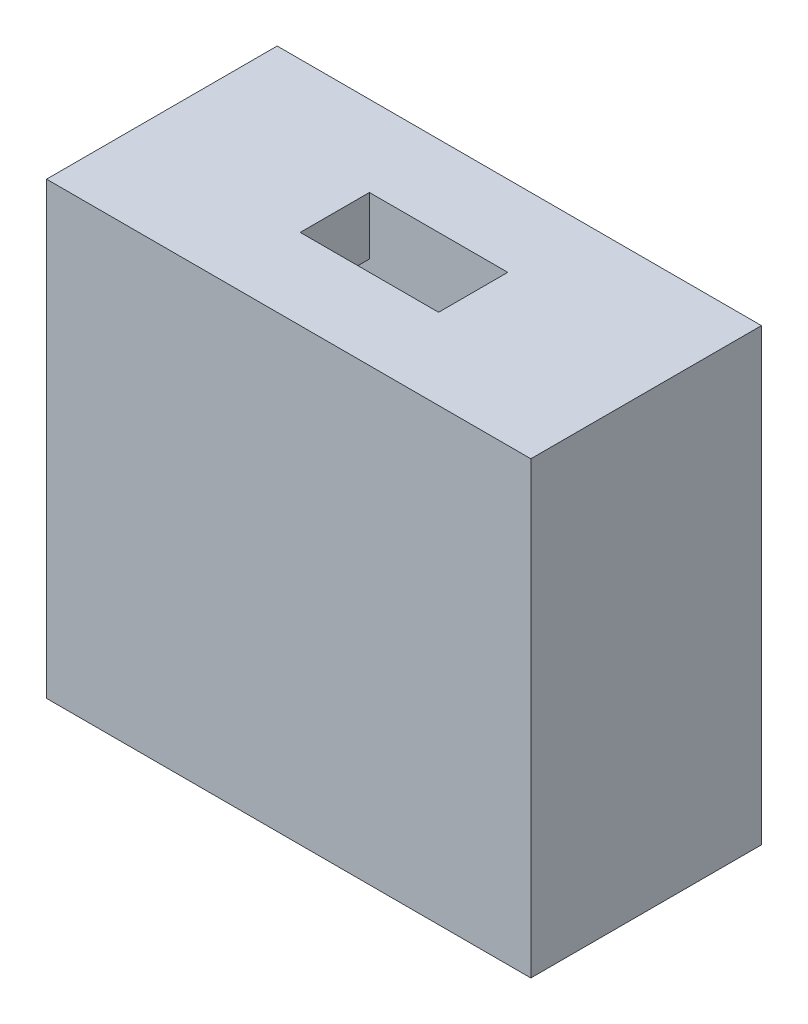
ISO-10303-21;
HEADER;
FILE_DESCRIPTION(('STEP AP214'),'2;1');
FILE_NAME('part.step','',(''),(''),'','','');
FILE_SCHEMA(('AUTOMOTIVE_DESIGN { 1 0 10303 214 1 1 1 1 }'));
ENDSEC;
DATA;
#1=APPLICATION_CONTEXT('core data for automotive mechanical design processes');
#2=APPLICATION_PROTOCOL_DEFINITION('international standard','automotive_design',2000,#1);
#3=PRODUCT_CONTEXT('',#1,'mechanical');
#4=PRODUCT('Part','Part','',(#3));
#5=PRODUCT_RELATED_PRODUCT_CATEGORY('part','',(#4));
#6=PRODUCT_DEFINITION_FORMATION('','',#4);
#7=PRODUCT_DEFINITION_CONTEXT('part definition',#1,'design');
#8=PRODUCT_DEFINITION('design','',#6,#7);
#9=PRODUCT_DEFINITION_SHAPE('','',#8);
#10=(LENGTH_UNIT() NAMED_UNIT(*) SI_UNIT(.MILLI.,.METRE.));
#11=(NAMED_UNIT(*) PLANE_ANGLE_UNIT() SI_UNIT($,.RADIAN.));
#12=(NAMED_UNIT(*) SI_UNIT($,.STERADIAN.) SOLID_ANGLE_UNIT());
#13=UNCERTAINTY_MEASURE_WITH_UNIT(LENGTH_MEASURE(1.E-05),#10,'distance_accuracy_value','');
#14=(GEOMETRIC_REPRESENTATION_CONTEXT(3) GLOBAL_UNCERTAINTY_ASSIGNED_CONTEXT((#13)) GLOBAL_UNIT_ASSIGNED_CONTEXT((#10,
#11,#12)) REPRESENTATION_CONTEXT('',''));
#15=CARTESIAN_POINT('',(0.,0.,0.));
#16=DIRECTION('',(0.,0.,1.));
#17=DIRECTION('',(1.,0.,0.));
#18=AXIS2_PLACEMENT_3D('',#15,#16,#17);
#19=CARTESIAN_POINT('',(21.,39.,-10.));
#20=DIRECTION('',(-1.,0.,0.));
#21=DIRECTION('',(0.,0.,1.));
#22=AXIS2_PLACEMENT_3D('',#19,#20,#21);
#23=PLANE('',#22);
#24=DIRECTION('',(0.,0.,-1.));
#25=VECTOR('',#24,1.);
#26=CARTESIAN_POINT('',(21.,0.,-10.));
#27=LINE('',#26,#25);
#28=CARTESIAN_POINT('',(21.,0.,10.));
#29=VERTEX_POINT('',#28);
#30=CARTESIAN_POINT('',(21.,0.,-10.));
#31=VERTEX_POINT('',#30);
#32=EDGE_CURVE('E159',#29,#31,#27,.T.);
#33=ORIENTED_EDGE('',*,*,#32,.T.);
#34=DIRECTION('',(0.,-1.,0.));
#35=VECTOR('',#34,1.);
#36=CARTESIAN_POINT('',(21.,39.,-10.));
#37=LINE('',#36,#35);
#38=CARTESIAN_POINT('',(21.,39.,-10.));
#39=VERTEX_POINT('',#38);
#40=EDGE_CURVE('E11',#39,#31,#37,.T.);
#41=ORIENTED_EDGE('',*,*,#40,.F.);
#42=DIRECTION('',(0.,0.,-1.));
#43=VECTOR('',#42,1.);
#44=CARTESIAN_POINT('',(21.,39.,-10.));
#45=LINE('',#44,#43);
#46=CARTESIAN_POINT('',(21.,39.,10.));
#47=VERTEX_POINT('',#46);
#48=EDGE_CURVE('E165',#47,#39,#45,.T.);
#49=ORIENTED_EDGE('',*,*,#48,.F.);
#50=DIRECTION('',(0.,-1.,0.));
#51=VECTOR('',#50,1.);
#52=CARTESIAN_POINT('',(21.,39.,10.));
#53=LINE('',#52,#51);
#54=EDGE_CURVE('E175',#47,#29,#53,.T.);
#55=ORIENTED_EDGE('',*,*,#54,.T.);
#56=EDGE_LOOP('',(#33,#41,#49,#55));
#57=FACE_BOUND('',#56,.T.);
#58=ADVANCED_FACE('F36',(#57),#23,.F.);
#59=CARTESIAN_POINT('',(-21.,39.,-10.));
#60=DIRECTION('',(0.,0.,1.));
#61=DIRECTION('',(1.,0.,0.));
#62=AXIS2_PLACEMENT_3D('',#59,#60,#61);
#63=PLANE('',#62);
#64=DIRECTION('',(-1.,0.,0.));
#65=VECTOR('',#64,1.);
#66=CARTESIAN_POINT('',(-21.,0.,-10.));
#67=LINE('',#66,#65);
#68=CARTESIAN_POINT('',(-21.,0.,-10.));
#69=VERTEX_POINT('',#68);
#70=EDGE_CURVE('E178',#31,#69,#67,.T.);
#71=ORIENTED_EDGE('',*,*,#70,.T.);
#72=DIRECTION('',(0.,-1.,0.));
#73=VECTOR('',#72,1.);
#74=CARTESIAN_POINT('',(-21.,39.,-10.));
#75=LINE('',#74,#73);
#76=CARTESIAN_POINT('',(-21.,39.,-10.));
#77=VERTEX_POINT('',#76);
#78=EDGE_CURVE('E43',#77,#69,#75,.T.);
#79=ORIENTED_EDGE('',*,*,#78,.F.);
#80=DIRECTION('',(-1.,0.,0.));
#81=VECTOR('',#80,1.);
#82=CARTESIAN_POINT('',(-21.,39.,-10.));
#83=LINE('',#82,#81);
#84=EDGE_CURVE('E168',#39,#77,#83,.T.);
#85=ORIENTED_EDGE('',*,*,#84,.F.);
#86=ORIENTED_EDGE('',*,*,#40,.T.);
#87=EDGE_LOOP('',(#71,#79,#85,#86));
#88=FACE_BOUND('',#87,.T.);
#89=ADVANCED_FACE('F206',(#88),#63,.F.);
#90=CARTESIAN_POINT('',(-21.,39.,-10.));
#91=DIRECTION('',(1.,0.,0.));
#92=DIRECTION('',(0.,0.,-1.));
#93=AXIS2_PLACEMENT_3D('',#90,#91,#92);
#94=PLANE('',#93);
#95=DIRECTION('',(0.,0.,1.));
#96=VECTOR('',#95,1.);
#97=CARTESIAN_POINT('',(-21.,34.,3.));
#98=LINE('',#97,#96);
#99=CARTESIAN_POINT('',(-21.,34.,-3.));
#100=VERTEX_POINT('',#99);
#101=CARTESIAN_POINT('',(-21.,34.,3.));
#102=VERTEX_POINT('',#101);
#103=EDGE_CURVE('E134',#100,#102,#98,.T.);
#104=ORIENTED_EDGE('',*,*,#103,.T.);
#105=DIRECTION('',(0.,-1.,0.));
#106=VECTOR('',#105,1.);
#107=CARTESIAN_POINT('',(-21.,29.,3.));
#108=LINE('',#107,#106);
#109=CARTESIAN_POINT('',(-21.,29.,3.));
#110=VERTEX_POINT('',#109);
#111=EDGE_CURVE('E118',#102,#110,#108,.T.);
#112=ORIENTED_EDGE('',*,*,#111,.T.);
#113=DIRECTION('',(0.,0.,-1.));
#114=VECTOR('',#113,1.);
#115=CARTESIAN_POINT('',(-21.,29.,3.));
#116=LINE('',#115,#114);
#117=CARTESIAN_POINT('',(-21.,29.,-3.));
#118=VERTEX_POINT('',#117);
#119=EDGE_CURVE('E125',#110,#118,#116,.T.);
#120=ORIENTED_EDGE('',*,*,#119,.T.);
#121=DIRECTION('',(0.,1.,0.));
#122=VECTOR('',#121,1.);
#123=CARTESIAN_POINT('',(-21.,29.,-3.));
#124=LINE('',#123,#122);
#125=EDGE_CURVE('E129',#118,#100,#124,.T.);
#126=ORIENTED_EDGE('',*,*,#125,.T.);
#127=EDGE_LOOP('',(#104,#112,#120,#126));
#128=FACE_BOUND('',#127,.T.);
#129=DIRECTION('',(0.,0.,1.));
#130=VECTOR('',#129,1.);
#131=CARTESIAN_POINT('',(-21.,0.,-10.));
#132=LINE('',#131,#130);
#133=CARTESIAN_POINT('',(-21.,0.,10.));
#134=VERTEX_POINT('',#133);
#135=EDGE_CURVE('E180',#69,#134,#132,.T.);
#136=ORIENTED_EDGE('',*,*,#135,.T.);
#137=DIRECTION('',(0.,-1.,0.));
#138=VECTOR('',#137,1.);
#139=CARTESIAN_POINT('',(-21.,39.,10.));
#140=LINE('',#139,#138);
#141=CARTESIAN_POINT('',(-21.,39.,10.));
#142=VERTEX_POINT('',#141);
#143=EDGE_CURVE('E185',#142,#134,#140,.T.);
#144=ORIENTED_EDGE('',*,*,#143,.F.);
#145=DIRECTION('',(0.,0.,1.));
#146=VECTOR('',#145,1.);
#147=CARTESIAN_POINT('',(-21.,39.,-10.));
#148=LINE('',#147,#146);
#149=EDGE_CURVE('E171',#77,#142,#148,.T.);
#150=ORIENTED_EDGE('',*,*,#149,.F.);
#151=ORIENTED_EDGE('',*,*,#78,.T.);
#152=EDGE_LOOP('',(#136,#144,#150,#151));
#153=FACE_BOUND('',#152,.T.);
#154=ADVANCED_FACE('F131',(#128,#153),#94,.F.);
#155=CARTESIAN_POINT('',(-21.,39.,10.));
#156=DIRECTION('',(0.,0.,-1.));
#157=DIRECTION('',(-1.,0.,0.));
#158=AXIS2_PLACEMENT_3D('',#155,#156,#157);
#159=PLANE('',#158);
#160=DIRECTION('',(1.,0.,0.));
#161=VECTOR('',#160,1.);
#162=CARTESIAN_POINT('',(-21.,0.,10.));
#163=LINE('',#162,#161);
#164=EDGE_CURVE('E169',#134,#29,#163,.T.);
#165=ORIENTED_EDGE('',*,*,#164,.T.);
#166=ORIENTED_EDGE('',*,*,#54,.F.);
#167=DIRECTION('',(1.,0.,0.));
#168=VECTOR('',#167,1.);
#169=CARTESIAN_POINT('',(-21.,39.,10.));
#170=LINE('',#169,#168);
#171=EDGE_CURVE('E173',#142,#47,#170,.T.);
#172=ORIENTED_EDGE('',*,*,#171,.F.);
#173=ORIENTED_EDGE('',*,*,#143,.T.);
#174=EDGE_LOOP('',(#165,#166,#172,#173));
#175=FACE_BOUND('',#174,.T.);
#176=ADVANCED_FACE('F199',(#175),#159,.F.);
#177=CARTESIAN_POINT('',(0.,39.,0.));
#178=DIRECTION('',(0.,1.,0.));
#179=DIRECTION('',(0.,0.,1.));
#180=AXIS2_PLACEMENT_3D('',#177,#178,#179);
#181=PLANE('',#180);
#182=DIRECTION('',(0.,0.,-1.));
#183=VECTOR('',#182,1.);
#184=CARTESIAN_POINT('',(6.,39.,3.));
#185=LINE('',#184,#183);
#186=CARTESIAN_POINT('',(6.,39.,3.));
#187=VERTEX_POINT('',#186);
#188=CARTESIAN_POINT('',(6.,39.,-3.));
#189=VERTEX_POINT('',#188);
#190=EDGE_CURVE('E58',#187,#189,#185,.T.);
#191=ORIENTED_EDGE('',*,*,#190,.F.);
#192=DIRECTION('',(1.,0.,0.));
#193=VECTOR('',#192,1.);
#194=CARTESIAN_POINT('',(-6.,39.,3.));
#195=LINE('',#194,#193);
#196=CARTESIAN_POINT('',(-6.,39.,3.));
#197=VERTEX_POINT('',#196);
#198=EDGE_CURVE('E148',#197,#187,#195,.T.);
#199=ORIENTED_EDGE('',*,*,#198,.F.);
#200=DIRECTION('',(0.,0.,1.));
#201=VECTOR('',#200,1.);
#202=CARTESIAN_POINT('',(-6.,39.,3.));
#203=LINE('',#202,#201);
#204=CARTESIAN_POINT('',(-6.,39.,-3.));
#205=VERTEX_POINT('',#204);
#206=EDGE_CURVE('E154',#205,#197,#203,.T.);
#207=ORIENTED_EDGE('',*,*,#206,.F.);
#208=DIRECTION('',(-1.,0.,0.));
#209=VECTOR('',#208,1.);
#210=CARTESIAN_POINT('',(-6.,39.,-3.));
#211=LINE('',#210,#209);
#212=EDGE_CURVE('E151',#189,#205,#211,.T.);
#213=ORIENTED_EDGE('',*,*,#212,.F.);
#214=EDGE_LOOP('',(#191,#199,#207,#213));
#215=FACE_BOUND('',#214,.T.);
#216=ORIENTED_EDGE('',*,*,#48,.T.);
#217=ORIENTED_EDGE('',*,*,#84,.T.);
#218=ORIENTED_EDGE('',*,*,#149,.T.);
#219=ORIENTED_EDGE('',*,*,#171,.T.);
#220=EDGE_LOOP('',(#216,#217,#218,#219));
#221=FACE_BOUND('',#220,.T.);
#222=ADVANCED_FACE('F205',(#215,#221),#181,.T.);
#223=CARTESIAN_POINT('',(0.,0.,0.));
#224=DIRECTION('',(0.,1.,0.));
#225=DIRECTION('',(0.,0.,1.));
#226=AXIS2_PLACEMENT_3D('',#223,#224,#225);
#227=PLANE('',#226);
#228=ORIENTED_EDGE('',*,*,#32,.F.);
#229=ORIENTED_EDGE('',*,*,#164,.F.);
#230=ORIENTED_EDGE('',*,*,#135,.F.);
#231=ORIENTED_EDGE('',*,*,#70,.F.);
#232=EDGE_LOOP('',(#228,#229,#230,#231));
#233=FACE_BOUND('',#232,.T.);
#234=ADVANCED_FACE('F196',(#233),#227,.F.);
#235=CARTESIAN_POINT('',(6.,29.,3.));
#236=DIRECTION('',(1.,0.,0.));
#237=DIRECTION('',(0.,0.,-1.));
#238=AXIS2_PLACEMENT_3D('',#235,#236,#237);
#239=PLANE('',#238);
#240=ORIENTED_EDGE('',*,*,#190,.T.);
#241=DIRECTION('',(0.,1.,0.));
#242=VECTOR('',#241,1.);
#243=CARTESIAN_POINT('',(6.,29.,-3.));
#244=LINE('',#243,#242);
#245=CARTESIAN_POINT('',(6.,29.,-3.));
#246=VERTEX_POINT('',#245);
#247=EDGE_CURVE('E122',#246,#189,#244,.T.);
#248=ORIENTED_EDGE('',*,*,#247,.F.);
#249=DIRECTION('',(0.,0.,-1.));
#250=VECTOR('',#249,1.);
#251=CARTESIAN_POINT('',(6.,29.,3.));
#252=LINE('',#251,#250);
#253=CARTESIAN_POINT('',(6.,29.,3.));
#254=VERTEX_POINT('',#253);
#255=EDGE_CURVE('E146',#254,#246,#252,.T.);
#256=ORIENTED_EDGE('',*,*,#255,.F.);
#257=DIRECTION('',(0.,1.,0.));
#258=VECTOR('',#257,1.);
#259=CARTESIAN_POINT('',(6.,29.,3.));
#260=LINE('',#259,#258);
#261=EDGE_CURVE('E120',#254,#187,#260,.T.);
#262=ORIENTED_EDGE('',*,*,#261,.T.);
#263=EDGE_LOOP('',(#240,#248,#256,#262));
#264=FACE_BOUND('',#263,.T.);
#265=ADVANCED_FACE('F219',(#264),#239,.F.);
#266=CARTESIAN_POINT('',(-6.,29.,3.));
#267=DIRECTION('',(0.,0.,1.));
#268=DIRECTION('',(1.,0.,0.));
#269=AXIS2_PLACEMENT_3D('',#266,#267,#268);
#270=PLANE('',#269);
#271=ORIENTED_EDGE('',*,*,#198,.T.);
#272=ORIENTED_EDGE('',*,*,#261,.F.);
#273=DIRECTION('',(1.,0.,0.));
#274=VECTOR('',#273,1.);
#275=CARTESIAN_POINT('',(-6.,29.,3.));
#276=LINE('',#275,#274);
#277=EDGE_CURVE('E114',#110,#254,#276,.T.);
#278=ORIENTED_EDGE('',*,*,#277,.F.);
#279=ORIENTED_EDGE('',*,*,#111,.F.);
#280=DIRECTION('',(1.,0.,0.));
#281=VECTOR('',#280,1.);
#282=CARTESIAN_POINT('',(-21.,34.,3.));
#283=LINE('',#282,#281);
#284=CARTESIAN_POINT('',(-6.,34.,3.));
#285=VERTEX_POINT('',#284);
#286=EDGE_CURVE('E143',#102,#285,#283,.T.);
#287=ORIENTED_EDGE('',*,*,#286,.T.);
#288=DIRECTION('',(0.,1.,0.));
#289=VECTOR('',#288,1.);
#290=CARTESIAN_POINT('',(-6.,29.,3.));
#291=LINE('',#290,#289);
#292=EDGE_CURVE('E160',#285,#197,#291,.T.);
#293=ORIENTED_EDGE('',*,*,#292,.T.);
#294=EDGE_LOOP('',(#271,#272,#278,#279,#287,#293));
#295=FACE_BOUND('',#294,.T.);
#296=ADVANCED_FACE('F116',(#295),#270,.F.);
#297=CARTESIAN_POINT('',(-6.,29.,3.));
#298=DIRECTION('',(-1.,0.,0.));
#299=DIRECTION('',(0.,0.,1.));
#300=AXIS2_PLACEMENT_3D('',#297,#298,#299);
#301=PLANE('',#300);
#302=ORIENTED_EDGE('',*,*,#292,.F.);
#303=DIRECTION('',(0.,0.,1.));
#304=VECTOR('',#303,1.);
#305=CARTESIAN_POINT('',(-6.,34.,3.));
#306=LINE('',#305,#304);
#307=CARTESIAN_POINT('',(-6.,34.,-3.));
#308=VERTEX_POINT('',#307);
#309=EDGE_CURVE('E135',#308,#285,#306,.T.);
#310=ORIENTED_EDGE('',*,*,#309,.F.);
#311=DIRECTION('',(0.,1.,0.));
#312=VECTOR('',#311,1.);
#313=CARTESIAN_POINT('',(-6.,29.,-3.));
#314=LINE('',#313,#312);
#315=EDGE_CURVE('E162',#308,#205,#314,.T.);
#316=ORIENTED_EDGE('',*,*,#315,.T.);
#317=ORIENTED_EDGE('',*,*,#206,.T.);
#318=EDGE_LOOP('',(#302,#310,#316,#317));
#319=FACE_BOUND('',#318,.T.);
#320=ADVANCED_FACE('F228',(#319),#301,.F.);
#321=CARTESIAN_POINT('',(-6.,29.,-3.));
#322=DIRECTION('',(0.,0.,-1.));
#323=DIRECTION('',(-1.,0.,0.));
#324=AXIS2_PLACEMENT_3D('',#321,#322,#323);
#325=PLANE('',#324);
#326=ORIENTED_EDGE('',*,*,#212,.T.);
#327=ORIENTED_EDGE('',*,*,#315,.F.);
#328=DIRECTION('',(1.,0.,0.));
#329=VECTOR('',#328,1.);
#330=CARTESIAN_POINT('',(-21.,34.,-3.));
#331=LINE('',#330,#329);
#332=EDGE_CURVE('E141',#100,#308,#331,.T.);
#333=ORIENTED_EDGE('',*,*,#332,.F.);
#334=ORIENTED_EDGE('',*,*,#125,.F.);
#335=DIRECTION('',(-1.,0.,0.));
#336=VECTOR('',#335,1.);
#337=CARTESIAN_POINT('',(-6.,29.,-3.));
#338=LINE('',#337,#336);
#339=EDGE_CURVE('E50',#246,#118,#338,.T.);
#340=ORIENTED_EDGE('',*,*,#339,.F.);
#341=ORIENTED_EDGE('',*,*,#247,.T.);
#342=EDGE_LOOP('',(#326,#327,#333,#334,#340,#341));
#343=FACE_BOUND('',#342,.T.);
#344=ADVANCED_FACE('F225',(#343),#325,.F.);
#345=CARTESIAN_POINT('',(0.,29.,0.));
#346=DIRECTION('',(0.,-1.,0.));
#347=DIRECTION('',(0.,0.,-1.));
#348=AXIS2_PLACEMENT_3D('',#345,#346,#347);
#349=PLANE('',#348);
#350=ORIENTED_EDGE('',*,*,#255,.T.);
#351=ORIENTED_EDGE('',*,*,#339,.T.);
#352=ORIENTED_EDGE('',*,*,#119,.F.);
#353=ORIENTED_EDGE('',*,*,#277,.T.);
#354=EDGE_LOOP('',(#350,#351,#352,#353));
#355=FACE_BOUND('',#354,.T.);
#356=ADVANCED_FACE('F126',(#355),#349,.F.);
#357=CARTESIAN_POINT('',(-21.,34.,3.));
#358=DIRECTION('',(0.,1.,0.));
#359=DIRECTION('',(0.,0.,1.));
#360=AXIS2_PLACEMENT_3D('',#357,#358,#359);
#361=PLANE('',#360);
#362=ORIENTED_EDGE('',*,*,#309,.T.);
#363=ORIENTED_EDGE('',*,*,#286,.F.);
#364=ORIENTED_EDGE('',*,*,#103,.F.);
#365=ORIENTED_EDGE('',*,*,#332,.T.);
#366=EDGE_LOOP('',(#362,#363,#364,#365));
#367=FACE_BOUND('',#366,.T.);
#368=ADVANCED_FACE('F237',(#367),#361,.F.);
#369=CLOSED_SHELL('',(#58,#89,#154,#176,#222,#234,#265,#296,#320,#344,#356,#368));
#370=MANIFOLD_SOLID_BREP('B2',#369);
#371=ADVANCED_BREP_SHAPE_REPRESENTATION('',(#18,#370),#14);
#372=SHAPE_DEFINITION_REPRESENTATION(#9,#371);
ENDSEC;
END-ISO-10303-21;
